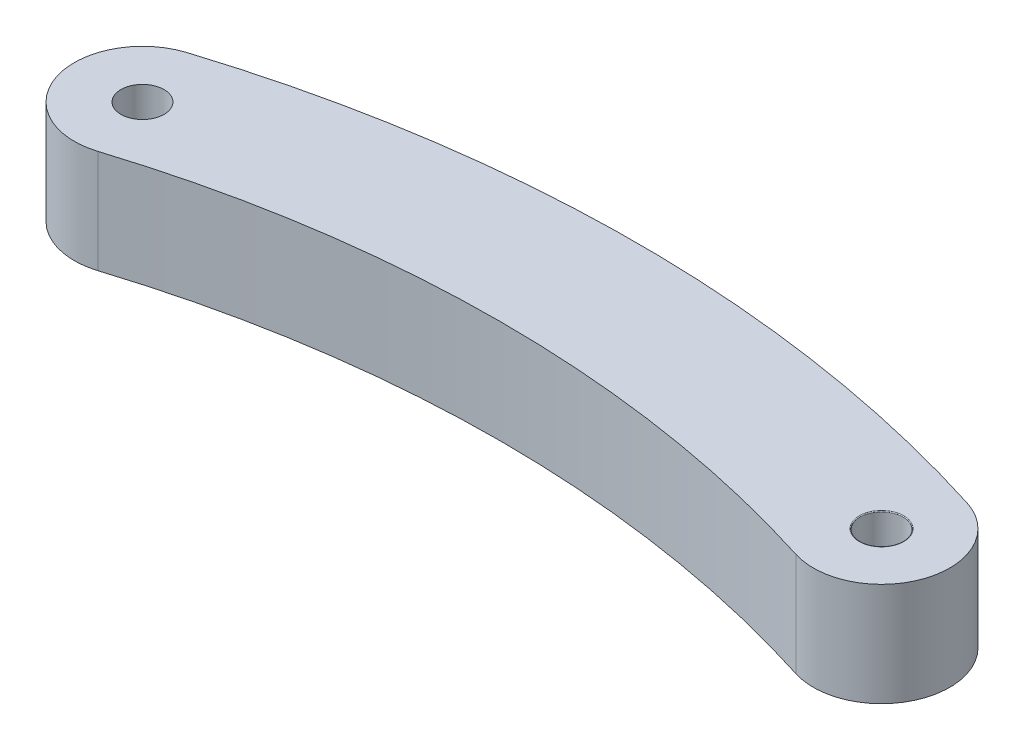
ISO-10303-21;
HEADER;
FILE_DESCRIPTION(('STEP AP214'),'2;1');
FILE_NAME('part.step','',(''),(''),'','','');
FILE_SCHEMA(('AUTOMOTIVE_DESIGN { 1 0 10303 214 1 1 1 1 }'));
ENDSEC;
DATA;
#1=APPLICATION_CONTEXT('core data for automotive mechanical design processes');
#2=APPLICATION_PROTOCOL_DEFINITION('international standard','automotive_design',2000,#1);
#3=PRODUCT_CONTEXT('',#1,'mechanical');
#4=PRODUCT('Part','Part','',(#3));
#5=PRODUCT_RELATED_PRODUCT_CATEGORY('part','',(#4));
#6=PRODUCT_DEFINITION_FORMATION('','',#4);
#7=PRODUCT_DEFINITION_CONTEXT('part definition',#1,'design');
#8=PRODUCT_DEFINITION('design','',#6,#7);
#9=PRODUCT_DEFINITION_SHAPE('','',#8);
#10=(LENGTH_UNIT() NAMED_UNIT(*) SI_UNIT(.MILLI.,.METRE.));
#11=(NAMED_UNIT(*) PLANE_ANGLE_UNIT() SI_UNIT($,.RADIAN.));
#12=(NAMED_UNIT(*) SI_UNIT($,.STERADIAN.) SOLID_ANGLE_UNIT());
#13=UNCERTAINTY_MEASURE_WITH_UNIT(LENGTH_MEASURE(1.E-05),#10,'distance_accuracy_value','');
#14=(GEOMETRIC_REPRESENTATION_CONTEXT(3) GLOBAL_UNCERTAINTY_ASSIGNED_CONTEXT((#13)) GLOBAL_UNIT_ASSIGNED_CONTEXT((#10,
#11,#12)) REPRESENTATION_CONTEXT('',''));
#15=CARTESIAN_POINT('',(0.,0.,0.));
#16=DIRECTION('',(0.,0.,1.));
#17=DIRECTION('',(1.,0.,0.));
#18=AXIS2_PLACEMENT_3D('',#15,#16,#17);
#19=CARTESIAN_POINT('',(-0.195273060227164,12.7,148.622400590184));
#20=DIRECTION('',(0.,-1.,0.));
#21=DIRECTION('',(0.,0.,-1.));
#22=AXIS2_PLACEMENT_3D('',#19,#20,#21);
#23=CYLINDRICAL_SURFACE('',#22,142.361929017854);
#24=CARTESIAN_POINT('',(-0.195273060227164,0.,148.622400590184));
#25=DIRECTION('',(0.,1.,0.));
#26=DIRECTION('',(0.,0.,1.));
#27=AXIS2_PLACEMENT_3D('',#24,#25,#26);
#28=CIRCLE('',#27,142.361929017854);
#29=CARTESIAN_POINT('',(-43.0737709297056,0.,12.8713296767591));
#30=VERTEX_POINT('',#29);
#31=CARTESIAN_POINT('',(42.6832248092513,0.,12.8713296767591));
#32=VERTEX_POINT('',#31);
#33=EDGE_CURVE('E110',#30,#32,#28,.F.);
#34=ORIENTED_EDGE('',*,*,#33,.T.);
#35=DIRECTION('',(0.,-1.,0.));
#36=VECTOR('',#35,1.);
#37=CARTESIAN_POINT('',(42.6832248092513,12.7,12.8713296767591));
#38=LINE('',#37,#36);
#39=CARTESIAN_POINT('',(42.6832248092513,12.7,12.8713296767591));
#40=VERTEX_POINT('',#39);
#41=EDGE_CURVE('E99',#40,#32,#38,.T.);
#42=ORIENTED_EDGE('',*,*,#41,.F.);
#43=CARTESIAN_POINT('',(-0.195273060227164,12.7,148.622400590184));
#44=DIRECTION('',(0.,1.,0.));
#45=DIRECTION('',(0.,0.,1.));
#46=AXIS2_PLACEMENT_3D('',#43,#44,#45);
#47=CIRCLE('',#46,142.361929017854);
#48=CARTESIAN_POINT('',(-43.0737709297056,12.7,12.8713296767591));
#49=VERTEX_POINT('',#48);
#50=EDGE_CURVE('E89',#49,#40,#47,.F.);
#51=ORIENTED_EDGE('',*,*,#50,.F.);
#52=DIRECTION('',(0.,-1.,0.));
#53=VECTOR('',#52,1.);
#54=CARTESIAN_POINT('',(-43.0737709297056,12.7,12.8713296767591));
#55=LINE('',#54,#53);
#56=EDGE_CURVE('E109',#49,#30,#55,.T.);
#57=ORIENTED_EDGE('',*,*,#56,.T.);
#58=EDGE_LOOP('',(#34,#42,#51,#57));
#59=FACE_BOUND('',#58,.T.);
#60=ADVANCED_FACE('F39',(#59),#23,.F.);
#61=CARTESIAN_POINT('',(45.2072269397728,12.7,4.88047157232992));
#62=DIRECTION('',(0.,-1.,0.));
#63=DIRECTION('',(0.,0.,-1.));
#64=AXIS2_PLACEMENT_3D('',#61,#62,#63);
#65=CYLINDRICAL_SURFACE('',#64,8.37999999999998);
#66=CARTESIAN_POINT('',(45.2072269397728,0.,4.88047157232992));
#67=DIRECTION('',(0.,1.,0.));
#68=DIRECTION('',(0.,0.,1.));
#69=AXIS2_PLACEMENT_3D('',#66,#67,#68);
#70=CIRCLE('',#69,8.37999999999998);
#71=CARTESIAN_POINT('',(47.7312290702945,0.,-3.11038653209929));
#72=VERTEX_POINT('',#71);
#73=EDGE_CURVE('E95',#32,#72,#70,.T.);
#74=ORIENTED_EDGE('',*,*,#73,.T.);
#75=DIRECTION('',(0.,-1.,0.));
#76=VECTOR('',#75,1.);
#77=CARTESIAN_POINT('',(47.7312290702945,12.7,-3.11038653209929));
#78=LINE('',#77,#76);
#79=CARTESIAN_POINT('',(47.7312290702945,12.7,-3.11038653209929));
#80=VERTEX_POINT('',#79);
#81=EDGE_CURVE('E93',#80,#72,#78,.T.);
#82=ORIENTED_EDGE('',*,*,#81,.F.);
#83=CARTESIAN_POINT('',(45.2072269397728,12.7,4.88047157232992));
#84=DIRECTION('',(0.,1.,0.));
#85=DIRECTION('',(0.,0.,1.));
#86=AXIS2_PLACEMENT_3D('',#83,#84,#85);
#87=CIRCLE('',#86,8.37999999999998);
#88=EDGE_CURVE('E83',#40,#80,#87,.T.);
#89=ORIENTED_EDGE('',*,*,#88,.F.);
#90=ORIENTED_EDGE('',*,*,#41,.T.);
#91=EDGE_LOOP('',(#74,#82,#89,#90));
#92=FACE_BOUND('',#91,.T.);
#93=ADVANCED_FACE('F94',(#92),#65,.T.);
#94=CARTESIAN_POINT('',(-0.195273060227151,12.7,148.622400590184));
#95=DIRECTION('',(0.,-1.,0.));
#96=DIRECTION('',(0.,0.,-1.));
#97=AXIS2_PLACEMENT_3D('',#94,#95,#96);
#98=CYLINDRICAL_SURFACE('',#97,159.121929017854);
#99=CARTESIAN_POINT('',(-0.195273060227151,0.,148.622400590184));
#100=DIRECTION('',(0.,1.,0.));
#101=DIRECTION('',(0.,0.,1.));
#102=AXIS2_PLACEMENT_3D('',#99,#100,#101);
#103=CIRCLE('',#102,159.121929017854);
#104=CARTESIAN_POINT('',(-48.1217751907488,0.,-3.11038653209929));
#105=VERTEX_POINT('',#104);
#106=EDGE_CURVE('E114',#105,#72,#103,.F.);
#107=ORIENTED_EDGE('',*,*,#106,.F.);
#108=DIRECTION('',(0.,-1.,0.));
#109=VECTOR('',#108,1.);
#110=CARTESIAN_POINT('',(-48.1217751907488,12.7,-3.11038653209929));
#111=LINE('',#110,#109);
#112=CARTESIAN_POINT('',(-48.1217751907488,12.7,-3.11038653209929));
#113=VERTEX_POINT('',#112);
#114=EDGE_CURVE('E72',#113,#105,#111,.T.);
#115=ORIENTED_EDGE('',*,*,#114,.F.);
#116=CARTESIAN_POINT('',(-0.195273060227151,12.7,148.622400590184));
#117=DIRECTION('',(0.,1.,0.));
#118=DIRECTION('',(0.,0.,1.));
#119=AXIS2_PLACEMENT_3D('',#116,#117,#118);
#120=CIRCLE('',#119,159.121929017854);
#121=EDGE_CURVE('E87',#113,#80,#120,.F.);
#122=ORIENTED_EDGE('',*,*,#121,.T.);
#123=ORIENTED_EDGE('',*,*,#81,.T.);
#124=EDGE_LOOP('',(#107,#115,#122,#123));
#125=FACE_BOUND('',#124,.T.);
#126=ADVANCED_FACE('F101',(#125),#98,.T.);
#127=CARTESIAN_POINT('',(-45.5977730602271,12.7,4.88047157232992));
#128=DIRECTION('',(0.,-1.,0.));
#129=DIRECTION('',(0.,0.,-1.));
#130=AXIS2_PLACEMENT_3D('',#127,#128,#129);
#131=CYLINDRICAL_SURFACE('',#130,2.65);
#132=CARTESIAN_POINT('',(-45.5977730602271,12.7,4.88047157232992));
#133=DIRECTION('',(0.,1.,0.));
#134=DIRECTION('',(0.,0.,1.));
#135=AXIS2_PLACEMENT_3D('',#132,#133,#134);
#136=CIRCLE('',#135,2.65);
#137=CARTESIAN_POINT('',(-45.5977730602271,12.7,7.53047157232992));
#138=VERTEX_POINT('',#137);
#139=EDGE_CURVE('E103',#138,#138,#136,.T.);
#140=ORIENTED_EDGE('',*,*,#139,.T.);
#141=EDGE_LOOP('',(#140));
#142=FACE_BOUND('',#141,.T.);
#143=CARTESIAN_POINT('',(-45.5977730602271,0.,4.88047157232992));
#144=DIRECTION('',(0.,1.,0.));
#145=DIRECTION('',(0.,0.,1.));
#146=AXIS2_PLACEMENT_3D('',#143,#144,#145);
#147=CIRCLE('',#146,2.65);
#148=CARTESIAN_POINT('',(-45.5977730602271,0.,7.53047157232992));
#149=VERTEX_POINT('',#148);
#150=EDGE_CURVE('E117',#149,#149,#147,.T.);
#151=ORIENTED_EDGE('',*,*,#150,.F.);
#152=EDGE_LOOP('',(#151));
#153=FACE_BOUND('',#152,.T.);
#154=ADVANCED_FACE('F149',(#142,#153),#131,.F.);
#155=CARTESIAN_POINT('',(-45.5977730602271,12.7,4.88047157232992));
#156=DIRECTION('',(0.,-1.,0.));
#157=DIRECTION('',(0.,0.,-1.));
#158=AXIS2_PLACEMENT_3D('',#155,#156,#157);
#159=CYLINDRICAL_SURFACE('',#158,8.37999999999998);
#160=CARTESIAN_POINT('',(-45.5977730602271,0.,4.88047157232992));
#161=DIRECTION('',(0.,1.,0.));
#162=DIRECTION('',(0.,0.,1.));
#163=AXIS2_PLACEMENT_3D('',#160,#161,#162);
#164=CIRCLE('',#163,8.37999999999998);
#165=EDGE_CURVE('E75',#105,#30,#164,.T.);
#166=ORIENTED_EDGE('',*,*,#165,.T.);
#167=ORIENTED_EDGE('',*,*,#56,.F.);
#168=CARTESIAN_POINT('',(-45.5977730602271,12.7,4.88047157232992));
#169=DIRECTION('',(0.,1.,0.));
#170=DIRECTION('',(0.,0.,1.));
#171=AXIS2_PLACEMENT_3D('',#168,#169,#170);
#172=CIRCLE('',#171,8.37999999999998);
#173=EDGE_CURVE('E56',#113,#49,#172,.T.);
#174=ORIENTED_EDGE('',*,*,#173,.F.);
#175=ORIENTED_EDGE('',*,*,#114,.T.);
#176=EDGE_LOOP('',(#166,#167,#174,#175));
#177=FACE_BOUND('',#176,.T.);
#178=ADVANCED_FACE('F150',(#177),#159,.T.);
#179=CARTESIAN_POINT('',(45.2072269397728,12.7,4.88047157232992));
#180=DIRECTION('',(0.,-1.,0.));
#181=DIRECTION('',(0.,0.,-1.));
#182=AXIS2_PLACEMENT_3D('',#179,#180,#181);
#183=CYLINDRICAL_SURFACE('',#182,2.65);
#184=CARTESIAN_POINT('',(45.2072269397728,12.6,4.88047157232992));
#185=DIRECTION('',(0.,1.,0.));
#186=DIRECTION('',(0.,0.,1.));
#187=AXIS2_PLACEMENT_3D('',#184,#185,#186);
#188=CIRCLE('',#187,2.65);
#189=CARTESIAN_POINT('',(45.2072269397728,12.6,7.53047157232992));
#190=VERTEX_POINT('',#189);
#191=EDGE_CURVE('E48',#190,#190,#188,.T.);
#192=ORIENTED_EDGE('',*,*,#191,.T.);
#193=EDGE_LOOP('',(#192));
#194=FACE_BOUND('',#193,.T.);
#195=CARTESIAN_POINT('',(45.2072269397728,0.,4.88047157232992));
#196=DIRECTION('',(0.,1.,0.));
#197=DIRECTION('',(0.,0.,1.));
#198=AXIS2_PLACEMENT_3D('',#195,#196,#197);
#199=CIRCLE('',#198,2.65);
#200=CARTESIAN_POINT('',(45.2072269397728,0.,7.53047157232992));
#201=VERTEX_POINT('',#200);
#202=EDGE_CURVE('E120',#201,#201,#199,.T.);
#203=ORIENTED_EDGE('',*,*,#202,.F.);
#204=EDGE_LOOP('',(#203));
#205=FACE_BOUND('',#204,.T.);
#206=ADVANCED_FACE('F128',(#194,#205),#183,.F.);
#207=CARTESIAN_POINT('',(0.,12.7,0.));
#208=DIRECTION('',(0.,1.,0.));
#209=DIRECTION('',(0.,0.,1.));
#210=AXIS2_PLACEMENT_3D('',#207,#208,#209);
#211=PLANE('',#210);
#212=CARTESIAN_POINT('',(45.2072269397728,12.7,4.88047157232992));
#213=DIRECTION('',(0.,1.,0.));
#214=DIRECTION('',(0.,0.,1.));
#215=AXIS2_PLACEMENT_3D('',#212,#213,#214);
#216=CIRCLE('',#215,2.75);
#217=CARTESIAN_POINT('',(45.2072269397728,12.7,7.63047157232992));
#218=VERTEX_POINT('',#217);
#219=EDGE_CURVE('E11',#218,#218,#216,.F.);
#220=ORIENTED_EDGE('',*,*,#219,.T.);
#221=EDGE_LOOP('',(#220));
#222=FACE_BOUND('',#221,.T.);
#223=ORIENTED_EDGE('',*,*,#50,.T.);
#224=ORIENTED_EDGE('',*,*,#88,.T.);
#225=ORIENTED_EDGE('',*,*,#121,.F.);
#226=ORIENTED_EDGE('',*,*,#173,.T.);
#227=EDGE_LOOP('',(#223,#224,#225,#226));
#228=FACE_BOUND('',#227,.T.);
#229=ORIENTED_EDGE('',*,*,#139,.F.);
#230=EDGE_LOOP('',(#229));
#231=FACE_BOUND('',#230,.T.);
#232=ADVANCED_FACE('F84',(#222,#228,#231),#211,.T.);
#233=CARTESIAN_POINT('',(0.,0.,0.));
#234=DIRECTION('',(0.,1.,0.));
#235=DIRECTION('',(0.,0.,1.));
#236=AXIS2_PLACEMENT_3D('',#233,#234,#235);
#237=PLANE('',#236);
#238=ORIENTED_EDGE('',*,*,#33,.F.);
#239=ORIENTED_EDGE('',*,*,#165,.F.);
#240=ORIENTED_EDGE('',*,*,#106,.T.);
#241=ORIENTED_EDGE('',*,*,#73,.F.);
#242=EDGE_LOOP('',(#238,#239,#240,#241));
#243=FACE_BOUND('',#242,.T.);
#244=ORIENTED_EDGE('',*,*,#150,.T.);
#245=EDGE_LOOP('',(#244));
#246=FACE_BOUND('',#245,.T.);
#247=ORIENTED_EDGE('',*,*,#202,.T.);
#248=EDGE_LOOP('',(#247));
#249=FACE_BOUND('',#248,.T.);
#250=ADVANCED_FACE('F132',(#243,#246,#249),#237,.F.);
#251=CARTESIAN_POINT('',(45.2072269397728,12.6,4.88047157232992));
#252=DIRECTION('',(0.,1.,0.));
#253=DIRECTION('',(0.,0.,1.));
#254=AXIS2_PLACEMENT_3D('',#251,#252,#253);
#255=TOROIDAL_SURFACE('',#254,2.75,0.1);
#256=ORIENTED_EDGE('',*,*,#219,.F.);
#257=EDGE_LOOP('',(#256));
#258=FACE_BOUND('',#257,.T.);
#259=ORIENTED_EDGE('',*,*,#191,.F.);
#260=EDGE_LOOP('',(#259));
#261=FACE_BOUND('',#260,.T.);
#262=ADVANCED_FACE('F41',(#258,#261),#255,.T.);
#263=CLOSED_SHELL('',(#60,#93,#126,#154,#178,#206,#232,#250,#262));
#264=MANIFOLD_SOLID_BREP('B2',#263);
#265=ADVANCED_BREP_SHAPE_REPRESENTATION('',(#18,#264),#14);
#266=SHAPE_DEFINITION_REPRESENTATION(#9,#265);
ENDSEC;
END-ISO-10303-21;
